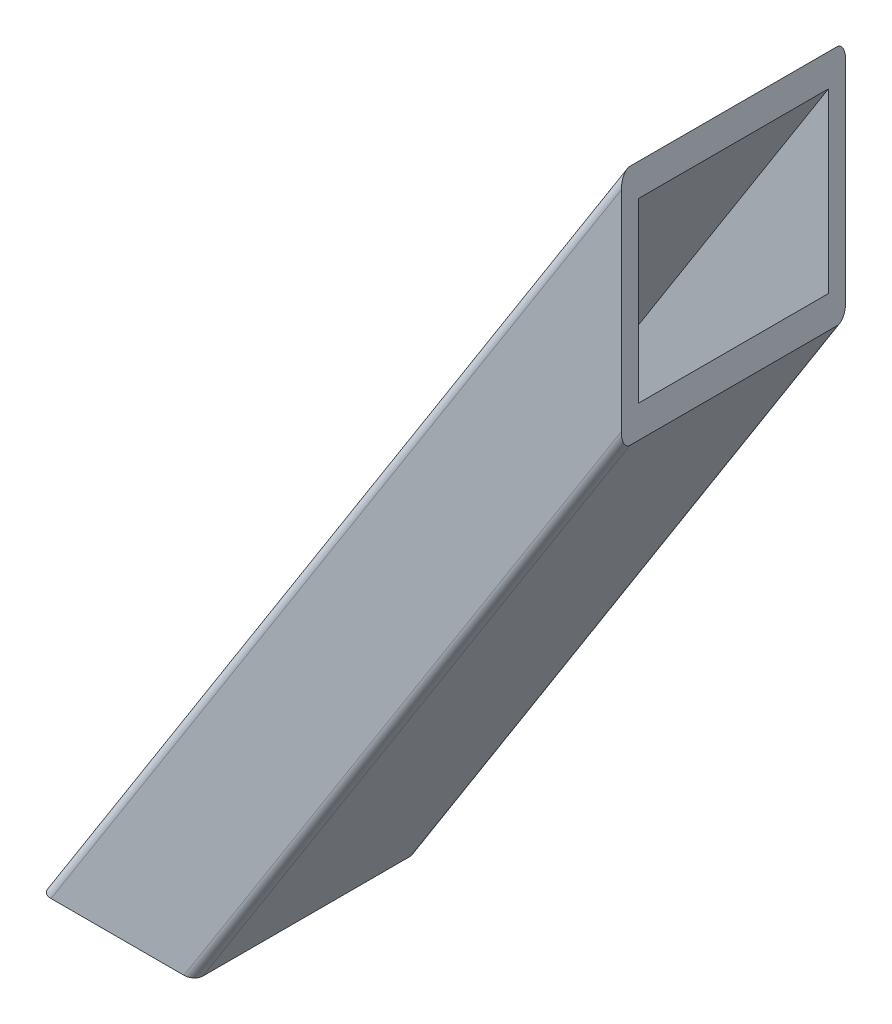
ISO-10303-21;
HEADER;
FILE_DESCRIPTION(('STEP AP214'),'2;1');
FILE_NAME('part.step','',(''),(''),'','','');
FILE_SCHEMA(('AUTOMOTIVE_DESIGN { 1 0 10303 214 1 1 1 1 }'));
ENDSEC;
DATA;
#1=APPLICATION_CONTEXT('core data for automotive mechanical design processes');
#2=APPLICATION_PROTOCOL_DEFINITION('international standard','automotive_design',2000,#1);
#3=PRODUCT_CONTEXT('',#1,'mechanical');
#4=PRODUCT('Part','Part','',(#3));
#5=PRODUCT_RELATED_PRODUCT_CATEGORY('part','',(#4));
#6=PRODUCT_DEFINITION_FORMATION('','',#4);
#7=PRODUCT_DEFINITION_CONTEXT('part definition',#1,'design');
#8=PRODUCT_DEFINITION('design','',#6,#7);
#9=PRODUCT_DEFINITION_SHAPE('','',#8);
#10=(LENGTH_UNIT() NAMED_UNIT(*) SI_UNIT(.MILLI.,.METRE.));
#11=(NAMED_UNIT(*) PLANE_ANGLE_UNIT() SI_UNIT($,.RADIAN.));
#12=(NAMED_UNIT(*) SI_UNIT($,.STERADIAN.) SOLID_ANGLE_UNIT());
#13=UNCERTAINTY_MEASURE_WITH_UNIT(LENGTH_MEASURE(1.E-05),#10,'distance_accuracy_value','');
#14=(GEOMETRIC_REPRESENTATION_CONTEXT(3) GLOBAL_UNCERTAINTY_ASSIGNED_CONTEXT((#13)) GLOBAL_UNIT_ASSIGNED_CONTEXT((#10,
#11,#12)) REPRESENTATION_CONTEXT('',''));
#15=CARTESIAN_POINT('',(0.,0.,0.));
#16=DIRECTION('',(0.,0.,1.));
#17=DIRECTION('',(1.,0.,0.));
#18=AXIS2_PLACEMENT_3D('',#15,#16,#17);
#19=CARTESIAN_POINT('',(49.4857273292242,106.,26.));
#20=DIRECTION('',(-1.,0.,0.));
#21=DIRECTION('',(0.,0.,1.));
#22=AXIS2_PLACEMENT_3D('',#19,#20,#21);
#23=PLANE('',#22);
#24=DIRECTION('',(0.,0.,-1.));
#25=VECTOR('',#24,1.);
#26=CARTESIAN_POINT('',(49.4857273292242,78.,26.));
#27=LINE('',#26,#25);
#28=CARTESIAN_POINT('',(49.4857273292242,78.,25.));
#29=VERTEX_POINT('',#28);
#30=CARTESIAN_POINT('',(49.4857273292242,78.,1.00000000000001));
#31=VERTEX_POINT('',#30);
#32=EDGE_CURVE('E217',#29,#31,#27,.T.);
#33=ORIENTED_EDGE('',*,*,#32,.T.);
#34=CARTESIAN_POINT('',(49.4857273292242,79.8666666666667,1.));
#35=DIRECTION('',(-1.,0.,0.));
#36=DIRECTION('',(0.,1.,0.));
#37=AXIS2_PLACEMENT_3D('',#34,#35,#36);
#38=ELLIPSE('',#37,1.86666666666667,1.);
#39=CARTESIAN_POINT('',(49.4857273292242,79.8666666666667,0.));
#40=VERTEX_POINT('',#39);
#41=EDGE_CURVE('E231',#31,#40,#38,.F.);
#42=ORIENTED_EDGE('',*,*,#41,.T.);
#43=DIRECTION('',(0.,1.,0.));
#44=VECTOR('',#43,1.);
#45=CARTESIAN_POINT('',(49.4857273292242,106.,0.));
#46=LINE('',#45,#44);
#47=CARTESIAN_POINT('',(49.4857273292242,104.133333333333,0.));
#48=VERTEX_POINT('',#47);
#49=EDGE_CURVE('E192',#40,#48,#46,.T.);
#50=ORIENTED_EDGE('',*,*,#49,.T.);
#51=CARTESIAN_POINT('',(49.4857273292242,104.133333333333,1.));
#52=DIRECTION('',(-1.,0.,0.));
#53=DIRECTION('',(0.,-1.,0.));
#54=AXIS2_PLACEMENT_3D('',#51,#52,#53);
#55=ELLIPSE('',#54,1.86666666666667,1.);
#56=CARTESIAN_POINT('',(49.4857273292242,106.,1.00000000000001));
#57=VERTEX_POINT('',#56);
#58=EDGE_CURVE('E229',#48,#57,#55,.F.);
#59=ORIENTED_EDGE('',*,*,#58,.T.);
#60=DIRECTION('',(0.,0.,-1.));
#61=VECTOR('',#60,1.);
#62=CARTESIAN_POINT('',(49.4857273292242,106.,26.));
#63=LINE('',#62,#61);
#64=CARTESIAN_POINT('',(49.4857273292242,106.,25.));
#65=VERTEX_POINT('',#64);
#66=EDGE_CURVE('E214',#65,#57,#63,.T.);
#67=ORIENTED_EDGE('',*,*,#66,.F.);
#68=CARTESIAN_POINT('',(49.4857273292242,104.133333333333,25.));
#69=DIRECTION('',(-1.,0.,0.));
#70=DIRECTION('',(0.,1.,0.));
#71=AXIS2_PLACEMENT_3D('',#68,#69,#70);
#72=ELLIPSE('',#71,1.86666666666667,1.);
#73=CARTESIAN_POINT('',(49.4857273292242,104.133333333333,26.));
#74=VERTEX_POINT('',#73);
#75=EDGE_CURVE('E225',#65,#74,#72,.F.);
#76=ORIENTED_EDGE('',*,*,#75,.T.);
#77=DIRECTION('',(0.,1.,0.));
#78=VECTOR('',#77,1.);
#79=CARTESIAN_POINT('',(49.4857273292242,106.,26.));
#80=LINE('',#79,#78);
#81=CARTESIAN_POINT('',(49.4857273292242,79.8666666666667,26.));
#82=VERTEX_POINT('',#81);
#83=EDGE_CURVE('E198',#82,#74,#80,.T.);
#84=ORIENTED_EDGE('',*,*,#83,.F.);
#85=CARTESIAN_POINT('',(49.4857273292242,79.8666666666667,25.));
#86=DIRECTION('',(-1.,0.,0.));
#87=DIRECTION('',(0.,-1.,0.));
#88=AXIS2_PLACEMENT_3D('',#85,#86,#87);
#89=ELLIPSE('',#88,1.86666666666667,1.);
#90=EDGE_CURVE('E227',#82,#29,#89,.F.);
#91=ORIENTED_EDGE('',*,*,#90,.T.);
#92=EDGE_LOOP('',(#33,#42,#50,#59,#67,#76,#84,#91));
#93=FACE_BOUND('',#92,.T.);
#94=DIRECTION('',(0.,1.,0.));
#95=VECTOR('',#94,1.);
#96=CARTESIAN_POINT('',(49.4857273292242,106.,2.));
#97=LINE('',#96,#95);
#98=CARTESIAN_POINT('',(49.4857273292242,81.7333333333333,2.));
#99=VERTEX_POINT('',#98);
#100=CARTESIAN_POINT('',(49.4857273292242,102.266666666667,2.));
#101=VERTEX_POINT('',#100);
#102=EDGE_CURVE('E176',#99,#101,#97,.T.);
#103=ORIENTED_EDGE('',*,*,#102,.F.);
#104=DIRECTION('',(0.,0.,-1.));
#105=VECTOR('',#104,1.);
#106=CARTESIAN_POINT('',(49.4857273292242,81.7333333333333,26.));
#107=LINE('',#106,#105);
#108=CARTESIAN_POINT('',(49.4857273292242,81.7333333333333,24.));
#109=VERTEX_POINT('',#108);
#110=EDGE_CURVE('E190',#109,#99,#107,.T.);
#111=ORIENTED_EDGE('',*,*,#110,.F.);
#112=DIRECTION('',(0.,1.,0.));
#113=VECTOR('',#112,1.);
#114=CARTESIAN_POINT('',(49.4857273292242,106.,24.));
#115=LINE('',#114,#113);
#116=CARTESIAN_POINT('',(49.4857273292242,102.266666666667,24.));
#117=VERTEX_POINT('',#116);
#118=EDGE_CURVE('E179',#109,#117,#115,.T.);
#119=ORIENTED_EDGE('',*,*,#118,.T.);
#120=DIRECTION('',(0.,0.,-1.));
#121=VECTOR('',#120,1.);
#122=CARTESIAN_POINT('',(49.4857273292242,102.266666666667,26.));
#123=LINE('',#122,#121);
#124=EDGE_CURVE('E186',#117,#101,#123,.T.);
#125=ORIENTED_EDGE('',*,*,#124,.T.);
#126=EDGE_LOOP('',(#103,#111,#119,#125));
#127=FACE_BOUND('',#126,.T.);
#128=ADVANCED_FACE('F37',(#93,#127),#23,.F.);
#129=CARTESIAN_POINT('',(0.,0.,26.));
#130=DIRECTION('',(-0.844399315538349,0.535714285714286,0.));
#131=DIRECTION('',(-0.535714285714286,-0.844399315538349,0.));
#132=AXIS2_PLACEMENT_3D('',#129,#130,#131);
#133=PLANE('',#132);
#134=DIRECTION('',(0.,0.,-1.));
#135=VECTOR('',#134,1.);
#136=CARTESIAN_POINT('',(0.,0.,26.));
#137=LINE('',#136,#135);
#138=CARTESIAN_POINT('',(0.,0.,25.));
#139=VERTEX_POINT('',#138);
#140=CARTESIAN_POINT('',(0.,0.,1.00000000000001));
#141=VERTEX_POINT('',#140);
#142=EDGE_CURVE('E205',#139,#141,#137,.T.);
#143=ORIENTED_EDGE('',*,*,#142,.T.);
#144=DIRECTION('',(0.535714285714286,0.844399315538349,0.));
#145=VECTOR('',#144,1.);
#146=CARTESIAN_POINT('',(0.,0.,1.));
#147=LINE('',#146,#145);
#148=EDGE_CURVE('E222',#141,#31,#147,.T.);
#149=ORIENTED_EDGE('',*,*,#148,.T.);
#150=ORIENTED_EDGE('',*,*,#32,.F.);
#151=DIRECTION('',(0.535714285714286,0.844399315538349,0.));
#152=VECTOR('',#151,1.);
#153=CARTESIAN_POINT('',(0.,0.,25.));
#154=LINE('',#153,#152);
#155=EDGE_CURVE('E220',#29,#139,#154,.F.);
#156=ORIENTED_EDGE('',*,*,#155,.T.);
#157=EDGE_LOOP('',(#143,#149,#150,#156));
#158=FACE_BOUND('',#157,.T.);
#159=ADVANCED_FACE('F278',(#158),#133,.F.);
#160=CARTESIAN_POINT('',(-17.7641072463882,0.,26.));
#161=DIRECTION('',(0.844399315538349,-0.535714285714286,0.));
#162=DIRECTION('',(0.535714285714286,0.844399315538349,0.));
#163=AXIS2_PLACEMENT_3D('',#160,#161,#162);
#164=PLANE('',#163);
#165=ORIENTED_EDGE('',*,*,#66,.T.);
#166=DIRECTION('',(-0.535714285714286,-0.844399315538349,0.));
#167=VECTOR('',#166,1.);
#168=CARTESIAN_POINT('',(-17.7641072463882,0.,1.));
#169=LINE('',#168,#167);
#170=CARTESIAN_POINT('',(-17.7641072463882,0.,1.00000000000001));
#171=VERTEX_POINT('',#170);
#172=EDGE_CURVE('E245',#57,#171,#169,.T.);
#173=ORIENTED_EDGE('',*,*,#172,.T.);
#174=DIRECTION('',(0.,0.,-1.));
#175=VECTOR('',#174,1.);
#176=CARTESIAN_POINT('',(-17.7641072463882,0.,26.));
#177=LINE('',#176,#175);
#178=CARTESIAN_POINT('',(-17.7641072463882,0.,25.));
#179=VERTEX_POINT('',#178);
#180=EDGE_CURVE('E212',#179,#171,#177,.T.);
#181=ORIENTED_EDGE('',*,*,#180,.F.);
#182=DIRECTION('',(-0.535714285714286,-0.844399315538349,0.));
#183=VECTOR('',#182,1.);
#184=CARTESIAN_POINT('',(49.4857273292242,106.,25.));
#185=LINE('',#184,#183);
#186=EDGE_CURVE('E243',#179,#65,#185,.F.);
#187=ORIENTED_EDGE('',*,*,#186,.T.);
#188=EDGE_LOOP('',(#165,#173,#181,#187));
#189=FACE_BOUND('',#188,.T.);
#190=ADVANCED_FACE('F265',(#189),#164,.F.);
#191=CARTESIAN_POINT('',(0.,0.,26.));
#192=DIRECTION('',(0.,1.,0.));
#193=DIRECTION('',(-1.,0.,0.));
#194=AXIS2_PLACEMENT_3D('',#191,#192,#193);
#195=PLANE('',#194);
#196=DIRECTION('',(0.,0.,1.));
#197=VECTOR('',#196,1.);
#198=CARTESIAN_POINT('',(-1.09968282953832,0.,2.));
#199=LINE('',#198,#197);
#200=CARTESIAN_POINT('',(-1.09968282953832,0.,2.));
#201=VERTEX_POINT('',#200);
#202=CARTESIAN_POINT('',(-1.09968282953832,0.,24.));
#203=VERTEX_POINT('',#202);
#204=EDGE_CURVE('E165',#201,#203,#199,.T.);
#205=ORIENTED_EDGE('',*,*,#204,.F.);
#206=DIRECTION('',(1.,0.,0.));
#207=VECTOR('',#206,1.);
#208=CARTESIAN_POINT('',(-14.126694810223,0.,2.));
#209=LINE('',#208,#207);
#210=CARTESIAN_POINT('',(-14.126694810223,0.,2.));
#211=VERTEX_POINT('',#210);
#212=EDGE_CURVE('E145',#211,#201,#209,.T.);
#213=ORIENTED_EDGE('',*,*,#212,.F.);
#214=DIRECTION('',(0.,0.,-1.));
#215=VECTOR('',#214,1.);
#216=CARTESIAN_POINT('',(-14.126694810223,0.,24.));
#217=LINE('',#216,#215);
#218=CARTESIAN_POINT('',(-14.126694810223,0.,24.));
#219=VERTEX_POINT('',#218);
#220=EDGE_CURVE('E156',#219,#211,#217,.T.);
#221=ORIENTED_EDGE('',*,*,#220,.F.);
#222=DIRECTION('',(-1.,0.,0.));
#223=VECTOR('',#222,1.);
#224=CARTESIAN_POINT('',(-1.09968282953832,0.,24.));
#225=LINE('',#224,#223);
#226=EDGE_CURVE('E167',#203,#219,#225,.T.);
#227=ORIENTED_EDGE('',*,*,#226,.F.);
#228=EDGE_LOOP('',(#205,#213,#221,#227));
#229=FACE_BOUND('',#228,.T.);
#230=DIRECTION('',(1.,0.,0.));
#231=VECTOR('',#230,1.);
#232=CARTESIAN_POINT('',(0.,0.,0.));
#233=LINE('',#232,#231);
#234=CARTESIAN_POINT('',(-16.5798334299623,0.,0.));
#235=VERTEX_POINT('',#234);
#236=CARTESIAN_POINT('',(-1.18427381642588,0.,0.));
#237=VERTEX_POINT('',#236);
#238=EDGE_CURVE('E202',#235,#237,#233,.T.);
#239=ORIENTED_EDGE('',*,*,#238,.T.);
#240=CARTESIAN_POINT('',(-1.18427381642588,0.,1.));
#241=DIRECTION('',(0.,1.,0.));
#242=DIRECTION('',(1.,0.,0.));
#243=AXIS2_PLACEMENT_3D('',#240,#241,#242);
#244=ELLIPSE('',#243,1.18427381642588,1.);
#245=EDGE_CURVE('E241',#237,#141,#244,.F.);
#246=ORIENTED_EDGE('',*,*,#245,.T.);
#247=ORIENTED_EDGE('',*,*,#142,.F.);
#248=CARTESIAN_POINT('',(-1.18427381642588,0.,25.));
#249=DIRECTION('',(0.,1.,0.));
#250=DIRECTION('',(-1.,0.,0.));
#251=AXIS2_PLACEMENT_3D('',#248,#249,#250);
#252=ELLIPSE('',#251,1.18427381642588,1.);
#253=CARTESIAN_POINT('',(-1.18427381642589,0.,26.));
#254=VERTEX_POINT('',#253);
#255=EDGE_CURVE('E238',#139,#254,#252,.F.);
#256=ORIENTED_EDGE('',*,*,#255,.T.);
#257=DIRECTION('',(1.,0.,0.));
#258=VECTOR('',#257,1.);
#259=CARTESIAN_POINT('',(0.,0.,26.));
#260=LINE('',#259,#258);
#261=CARTESIAN_POINT('',(-16.5798334299623,0.,26.));
#262=VERTEX_POINT('',#261);
#263=EDGE_CURVE('E201',#262,#254,#260,.T.);
#264=ORIENTED_EDGE('',*,*,#263,.F.);
#265=CARTESIAN_POINT('',(-16.5798334299623,0.,25.));
#266=DIRECTION('',(0.,1.,0.));
#267=DIRECTION('',(1.,0.,0.));
#268=AXIS2_PLACEMENT_3D('',#265,#266,#267);
#269=ELLIPSE('',#268,1.18427381642588,1.);
#270=EDGE_CURVE('E60',#262,#179,#269,.F.);
#271=ORIENTED_EDGE('',*,*,#270,.T.);
#272=ORIENTED_EDGE('',*,*,#180,.T.);
#273=CARTESIAN_POINT('',(-16.5798334299623,0.,1.));
#274=DIRECTION('',(0.,1.,0.));
#275=DIRECTION('',(-1.,0.,0.));
#276=AXIS2_PLACEMENT_3D('',#273,#274,#275);
#277=ELLIPSE('',#276,1.18427381642588,1.);
#278=EDGE_CURVE('E52',#171,#235,#277,.F.);
#279=ORIENTED_EDGE('',*,*,#278,.T.);
#280=EDGE_LOOP('',(#239,#246,#247,#256,#264,#271,#272,#279));
#281=FACE_BOUND('',#280,.T.);
#282=ADVANCED_FACE('F163',(#229,#281),#195,.F.);
#283=CARTESIAN_POINT('',(0.,0.,26.));
#284=DIRECTION('',(0.,0.,1.));
#285=DIRECTION('',(1.,0.,0.));
#286=AXIS2_PLACEMENT_3D('',#283,#284,#285);
#287=PLANE('',#286);
#288=ORIENTED_EDGE('',*,*,#263,.T.);
#289=DIRECTION('',(0.535714285714286,0.844399315538349,0.));
#290=VECTOR('',#289,1.);
#291=CARTESIAN_POINT('',(48.6413280136859,78.5357142857143,26.));
#292=LINE('',#291,#290);
#293=EDGE_CURVE('E11',#254,#82,#292,.T.);
#294=ORIENTED_EDGE('',*,*,#293,.T.);
#295=ORIENTED_EDGE('',*,*,#83,.T.);
#296=DIRECTION('',(-0.535714285714286,-0.844399315538349,0.));
#297=VECTOR('',#296,1.);
#298=CARTESIAN_POINT('',(-16.9197079308498,-0.535714285714285,26.));
#299=LINE('',#298,#297);
#300=EDGE_CURVE('E45',#74,#262,#299,.T.);
#301=ORIENTED_EDGE('',*,*,#300,.T.);
#302=EDGE_LOOP('',(#288,#294,#295,#301));
#303=FACE_BOUND('',#302,.T.);
#304=ADVANCED_FACE('F249',(#303),#287,.T.);
#305=CARTESIAN_POINT('',(0.,0.,0.));
#306=DIRECTION('',(0.,0.,1.));
#307=DIRECTION('',(1.,0.,0.));
#308=AXIS2_PLACEMENT_3D('',#305,#306,#307);
#309=PLANE('',#308);
#310=ORIENTED_EDGE('',*,*,#49,.F.);
#311=DIRECTION('',(0.535714285714286,0.844399315538349,0.));
#312=VECTOR('',#311,1.);
#313=CARTESIAN_POINT('',(-0.844399315538349,0.535714285714286,0.));
#314=LINE('',#313,#312);
#315=EDGE_CURVE('E235',#40,#237,#314,.F.);
#316=ORIENTED_EDGE('',*,*,#315,.T.);
#317=ORIENTED_EDGE('',*,*,#238,.F.);
#318=DIRECTION('',(-0.535714285714286,-0.844399315538349,0.));
#319=VECTOR('',#318,1.);
#320=CARTESIAN_POINT('',(-11.8215904175369,7.5,0.));
#321=LINE('',#320,#319);
#322=EDGE_CURVE('E233',#235,#48,#321,.F.);
#323=ORIENTED_EDGE('',*,*,#322,.T.);
#324=EDGE_LOOP('',(#310,#316,#317,#323));
#325=FACE_BOUND('',#324,.T.);
#326=ADVANCED_FACE('F270',(#325),#309,.F.);
#327=CARTESIAN_POINT('',(-1.6887986310767,1.07142857142857,26.));
#328=DIRECTION('',(-0.844399315538349,0.535714285714286,0.));
#329=DIRECTION('',(-0.535714285714286,-0.844399315538349,0.));
#330=AXIS2_PLACEMENT_3D('',#327,#328,#329);
#331=PLANE('',#330);
#332=DIRECTION('',(0.535714285714286,0.844399315538349,0.));
#333=VECTOR('',#332,1.);
#334=CARTESIAN_POINT('',(-1.6887986310767,1.07142857142857,2.));
#335=LINE('',#334,#333);
#336=CARTESIAN_POINT('',(-1.09968282953832,2.,2.));
#337=VERTEX_POINT('',#336);
#338=EDGE_CURVE('E160',#337,#99,#335,.T.);
#339=ORIENTED_EDGE('',*,*,#338,.F.);
#340=DIRECTION('',(0.,0.,-1.));
#341=VECTOR('',#340,1.);
#342=CARTESIAN_POINT('',(-1.09968282953832,2.,26.));
#343=LINE('',#342,#341);
#344=CARTESIAN_POINT('',(-1.09968282953832,2.,24.));
#345=VERTEX_POINT('',#344);
#346=EDGE_CURVE('E180',#345,#337,#343,.T.);
#347=ORIENTED_EDGE('',*,*,#346,.F.);
#348=DIRECTION('',(0.535714285714286,0.844399315538349,0.));
#349=VECTOR('',#348,1.);
#350=CARTESIAN_POINT('',(-1.6887986310767,1.07142857142857,24.));
#351=LINE('',#350,#349);
#352=EDGE_CURVE('E177',#345,#109,#351,.T.);
#353=ORIENTED_EDGE('',*,*,#352,.T.);
#354=ORIENTED_EDGE('',*,*,#110,.T.);
#355=EDGE_LOOP('',(#339,#347,#353,#354));
#356=FACE_BOUND('',#355,.T.);
#357=ADVANCED_FACE('F324',(#356),#331,.T.);
#358=CARTESIAN_POINT('',(-16.0753086153115,-1.07142857142857,26.));
#359=DIRECTION('',(0.844399315538349,-0.535714285714286,0.));
#360=DIRECTION('',(0.535714285714286,0.844399315538349,0.));
#361=AXIS2_PLACEMENT_3D('',#358,#359,#360);
#362=PLANE('',#361);
#363=DIRECTION('',(-0.535714285714286,-0.844399315538349,0.));
#364=VECTOR('',#363,1.);
#365=CARTESIAN_POINT('',(-16.0753086153115,-1.07142857142857,2.));
#366=LINE('',#365,#364);
#367=CARTESIAN_POINT('',(-14.126694810223,2.,2.));
#368=VERTEX_POINT('',#367);
#369=EDGE_CURVE('E148',#101,#368,#366,.T.);
#370=ORIENTED_EDGE('',*,*,#369,.F.);
#371=ORIENTED_EDGE('',*,*,#124,.F.);
#372=DIRECTION('',(-0.535714285714286,-0.844399315538349,0.));
#373=VECTOR('',#372,1.);
#374=CARTESIAN_POINT('',(-16.0753086153115,-1.07142857142857,24.));
#375=LINE('',#374,#373);
#376=CARTESIAN_POINT('',(-14.126694810223,2.,24.));
#377=VERTEX_POINT('',#376);
#378=EDGE_CURVE('E184',#117,#377,#375,.T.);
#379=ORIENTED_EDGE('',*,*,#378,.T.);
#380=DIRECTION('',(0.,0.,-1.));
#381=VECTOR('',#380,1.);
#382=CARTESIAN_POINT('',(-14.126694810223,2.,26.));
#383=LINE('',#382,#381);
#384=EDGE_CURVE('E183',#377,#368,#383,.T.);
#385=ORIENTED_EDGE('',*,*,#384,.T.);
#386=EDGE_LOOP('',(#370,#371,#379,#385));
#387=FACE_BOUND('',#386,.T.);
#388=ADVANCED_FACE('F393',(#387),#362,.T.);
#389=CARTESIAN_POINT('',(0.,0.,24.));
#390=DIRECTION('',(0.,0.,1.));
#391=DIRECTION('',(1.,0.,0.));
#392=AXIS2_PLACEMENT_3D('',#389,#390,#391);
#393=PLANE('',#392);
#394=ORIENTED_EDGE('',*,*,#352,.F.);
#395=DIRECTION('',(0.,1.,0.));
#396=VECTOR('',#395,1.);
#397=CARTESIAN_POINT('',(-1.09968282953832,-0.00100000000000013,24.));
#398=LINE('',#397,#396);
#399=EDGE_CURVE('E172',#203,#345,#398,.T.);
#400=ORIENTED_EDGE('',*,*,#399,.F.);
#401=ORIENTED_EDGE('',*,*,#226,.T.);
#402=DIRECTION('',(0.,1.,0.));
#403=VECTOR('',#402,1.);
#404=CARTESIAN_POINT('',(-14.126694810223,-0.00100000000000013,24.));
#405=LINE('',#404,#403);
#406=EDGE_CURVE('E152',#219,#377,#405,.T.);
#407=ORIENTED_EDGE('',*,*,#406,.T.);
#408=ORIENTED_EDGE('',*,*,#378,.F.);
#409=ORIENTED_EDGE('',*,*,#118,.F.);
#410=EDGE_LOOP('',(#394,#400,#401,#407,#408,#409));
#411=FACE_BOUND('',#410,.T.);
#412=ADVANCED_FACE('F383',(#411),#393,.F.);
#413=CARTESIAN_POINT('',(0.,0.,2.));
#414=DIRECTION('',(0.,0.,1.));
#415=DIRECTION('',(1.,0.,0.));
#416=AXIS2_PLACEMENT_3D('',#413,#414,#415);
#417=PLANE('',#416);
#418=ORIENTED_EDGE('',*,*,#338,.T.);
#419=ORIENTED_EDGE('',*,*,#102,.T.);
#420=ORIENTED_EDGE('',*,*,#369,.T.);
#421=DIRECTION('',(0.,1.,0.));
#422=VECTOR('',#421,1.);
#423=CARTESIAN_POINT('',(-14.126694810223,-0.00100000000000013,2.));
#424=LINE('',#423,#422);
#425=EDGE_CURVE('E140',#211,#368,#424,.T.);
#426=ORIENTED_EDGE('',*,*,#425,.F.);
#427=ORIENTED_EDGE('',*,*,#212,.T.);
#428=DIRECTION('',(0.,1.,0.));
#429=VECTOR('',#428,1.);
#430=CARTESIAN_POINT('',(-1.09968282953832,-0.00100000000000013,2.));
#431=LINE('',#430,#429);
#432=EDGE_CURVE('E161',#201,#337,#431,.T.);
#433=ORIENTED_EDGE('',*,*,#432,.T.);
#434=EDGE_LOOP('',(#418,#419,#420,#426,#427,#433));
#435=FACE_BOUND('',#434,.T.);
#436=ADVANCED_FACE('F143',(#435),#417,.T.);
#437=CARTESIAN_POINT('',(-1.09968282953832,-0.00100000000000013,2.));
#438=DIRECTION('',(1.,0.,0.));
#439=DIRECTION('',(0.,1.,0.));
#440=AXIS2_PLACEMENT_3D('',#437,#438,#439);
#441=PLANE('',#440);
#442=ORIENTED_EDGE('',*,*,#204,.T.);
#443=ORIENTED_EDGE('',*,*,#399,.T.);
#444=ORIENTED_EDGE('',*,*,#346,.T.);
#445=ORIENTED_EDGE('',*,*,#432,.F.);
#446=EDGE_LOOP('',(#442,#443,#444,#445));
#447=FACE_BOUND('',#446,.T.);
#448=ADVANCED_FACE('F365',(#447),#441,.F.);
#449=CARTESIAN_POINT('',(-14.126694810223,-0.00100000000000013,24.));
#450=DIRECTION('',(-1.,0.,0.));
#451=DIRECTION('',(0.,-1.,0.));
#452=AXIS2_PLACEMENT_3D('',#449,#450,#451);
#453=PLANE('',#452);
#454=ORIENTED_EDGE('',*,*,#220,.T.);
#455=ORIENTED_EDGE('',*,*,#425,.T.);
#456=ORIENTED_EDGE('',*,*,#384,.F.);
#457=ORIENTED_EDGE('',*,*,#406,.F.);
#458=EDGE_LOOP('',(#454,#455,#456,#457));
#459=FACE_BOUND('',#458,.T.);
#460=ADVANCED_FACE('F157',(#459),#453,.F.);
#461=CARTESIAN_POINT('',(-0.844399315538349,0.535714285714286,1.));
#462=DIRECTION('',(0.535714285714286,0.844399315538349,0.));
#463=DIRECTION('',(-0.844399315538349,0.535714285714286,0.));
#464=AXIS2_PLACEMENT_3D('',#461,#462,#463);
#465=CYLINDRICAL_SURFACE('',#464,1.);
#466=ORIENTED_EDGE('',*,*,#245,.F.);
#467=ORIENTED_EDGE('',*,*,#315,.F.);
#468=ORIENTED_EDGE('',*,*,#41,.F.);
#469=ORIENTED_EDGE('',*,*,#148,.F.);
#470=EDGE_LOOP('',(#466,#467,#468,#469));
#471=FACE_BOUND('',#470,.T.);
#472=ADVANCED_FACE('F275',(#471),#465,.T.);
#473=CARTESIAN_POINT('',(-16.9197079308498,-0.535714285714286,1.));
#474=DIRECTION('',(-0.535714285714286,-0.844399315538349,0.));
#475=DIRECTION('',(0.844399315538349,-0.535714285714286,0.));
#476=AXIS2_PLACEMENT_3D('',#473,#474,#475);
#477=CYLINDRICAL_SURFACE('',#476,1.);
#478=ORIENTED_EDGE('',*,*,#58,.F.);
#479=ORIENTED_EDGE('',*,*,#322,.F.);
#480=ORIENTED_EDGE('',*,*,#278,.F.);
#481=ORIENTED_EDGE('',*,*,#172,.F.);
#482=EDGE_LOOP('',(#478,#479,#480,#481));
#483=FACE_BOUND('',#482,.T.);
#484=ADVANCED_FACE('F273',(#483),#477,.T.);
#485=CARTESIAN_POINT('',(-0.844399315538349,0.535714285714286,25.));
#486=DIRECTION('',(-0.535714285714286,-0.844399315538349,0.));
#487=DIRECTION('',(0.844399315538349,-0.535714285714286,0.));
#488=AXIS2_PLACEMENT_3D('',#485,#486,#487);
#489=CYLINDRICAL_SURFACE('',#488,1.);
#490=ORIENTED_EDGE('',*,*,#255,.F.);
#491=ORIENTED_EDGE('',*,*,#155,.F.);
#492=ORIENTED_EDGE('',*,*,#90,.F.);
#493=ORIENTED_EDGE('',*,*,#293,.F.);
#494=EDGE_LOOP('',(#490,#491,#492,#493));
#495=FACE_BOUND('',#494,.T.);
#496=ADVANCED_FACE('F258',(#495),#489,.T.);
#497=CARTESIAN_POINT('',(-11.8215904175369,7.5,25.));
#498=DIRECTION('',(0.535714285714286,0.844399315538349,0.));
#499=DIRECTION('',(-0.844399315538349,0.535714285714286,0.));
#500=AXIS2_PLACEMENT_3D('',#497,#498,#499);
#501=CYLINDRICAL_SURFACE('',#500,1.);
#502=ORIENTED_EDGE('',*,*,#75,.F.);
#503=ORIENTED_EDGE('',*,*,#186,.F.);
#504=ORIENTED_EDGE('',*,*,#270,.F.);
#505=ORIENTED_EDGE('',*,*,#300,.F.);
#506=EDGE_LOOP('',(#502,#503,#504,#505));
#507=FACE_BOUND('',#506,.T.);
#508=ADVANCED_FACE('F39',(#507),#501,.T.);
#509=CLOSED_SHELL('',(#128,#159,#190,#282,#304,#326,#357,#388,#412,#436,#448,#460,#472,#484,
#496,#508));
#510=MANIFOLD_SOLID_BREP('B2',#509);
#511=ADVANCED_BREP_SHAPE_REPRESENTATION('',(#18,#510),#14);
#512=SHAPE_DEFINITION_REPRESENTATION(#9,#511);
ENDSEC;
END-ISO-10303-21;
